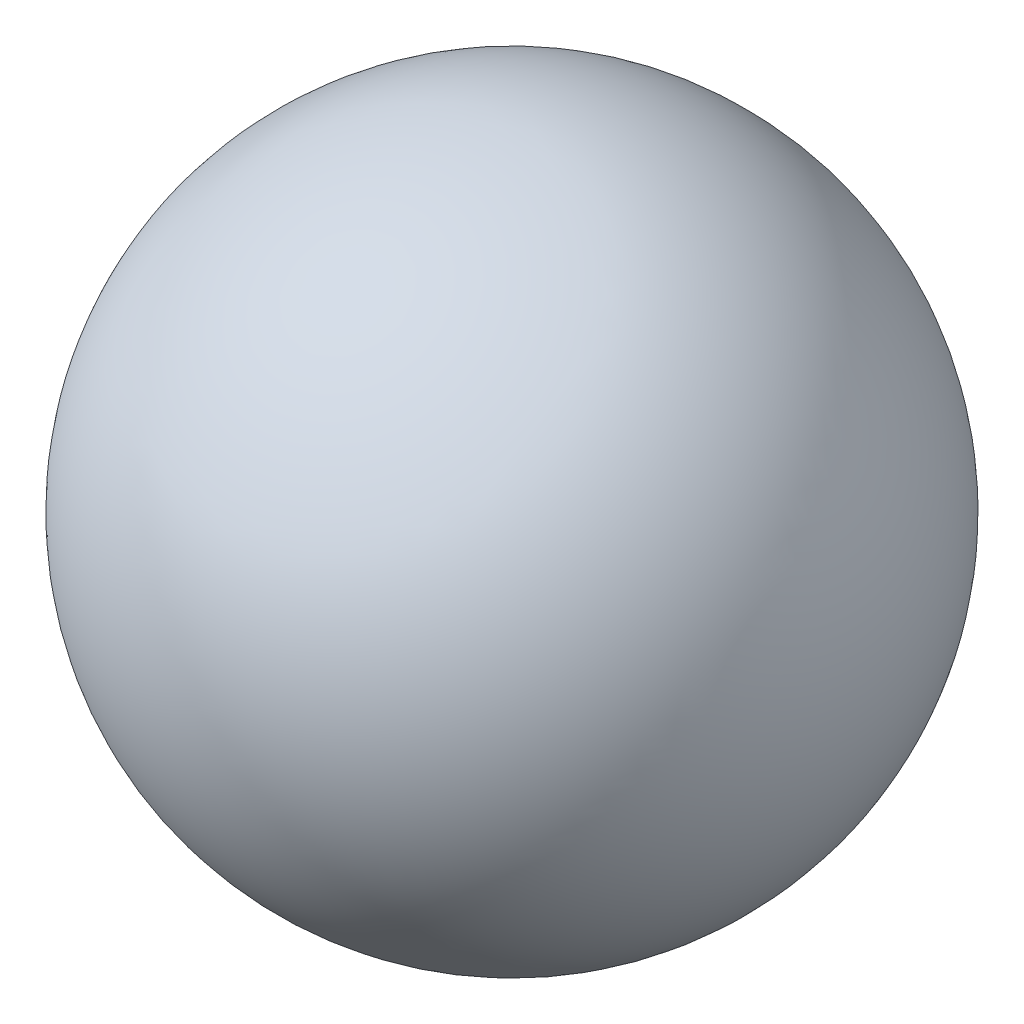
ISO-10303-21;
HEADER;
FILE_DESCRIPTION(('STEP AP214'),'2;1');
FILE_NAME('part.step','',(''),(''),'','','');
FILE_SCHEMA(('AUTOMOTIVE_DESIGN { 1 0 10303 214 1 1 1 1 }'));
ENDSEC;
DATA;
#1=APPLICATION_CONTEXT('core data for automotive mechanical design processes');
#2=APPLICATION_PROTOCOL_DEFINITION('international standard','automotive_design',2000,#1);
#3=PRODUCT_CONTEXT('',#1,'mechanical');
#4=PRODUCT('Part','Part','',(#3));
#5=PRODUCT_RELATED_PRODUCT_CATEGORY('part','',(#4));
#6=PRODUCT_DEFINITION_FORMATION('','',#4);
#7=PRODUCT_DEFINITION_CONTEXT('part definition',#1,'design');
#8=PRODUCT_DEFINITION('design','',#6,#7);
#9=PRODUCT_DEFINITION_SHAPE('','',#8);
#10=(LENGTH_UNIT() NAMED_UNIT(*) SI_UNIT(.MILLI.,.METRE.));
#11=(NAMED_UNIT(*) PLANE_ANGLE_UNIT() SI_UNIT($,.RADIAN.));
#12=(NAMED_UNIT(*) SI_UNIT($,.STERADIAN.) SOLID_ANGLE_UNIT());
#13=UNCERTAINTY_MEASURE_WITH_UNIT(LENGTH_MEASURE(1.E-05),#10,'distance_accuracy_value','');
#14=(GEOMETRIC_REPRESENTATION_CONTEXT(3) GLOBAL_UNCERTAINTY_ASSIGNED_CONTEXT((#13)) GLOBAL_UNIT_ASSIGNED_CONTEXT((#10,
#11,#12)) REPRESENTATION_CONTEXT('',''));
#15=CARTESIAN_POINT('',(0.,0.,0.));
#16=DIRECTION('',(0.,0.,1.));
#17=DIRECTION('',(1.,0.,0.));
#18=AXIS2_PLACEMENT_3D('',#15,#16,#17);
#19=CARTESIAN_POINT('',(1.5,2.95,0.));
#20=DIRECTION('',(-1.,0.,0.));
#21=DIRECTION('',(0.,-1.,0.));
#22=AXIS2_PLACEMENT_3D('',#19,#20,#21);
#23=SPHERICAL_SURFACE('',#22,0.6);
#24=CARTESIAN_POINT('',(0.9,2.95,0.));
#25=VERTEX_POINT('',#24);
#26=VERTEX_LOOP('',#25);
#27=FACE_BOUND('',#26,.T.);
#28=ADVANCED_FACE('F28',(#27),#23,.T.);
#29=CLOSED_SHELL('',(#28));
#30=MANIFOLD_SOLID_BREP('B2',#29);
#31=ADVANCED_BREP_SHAPE_REPRESENTATION('',(#18,#30),#14);
#32=SHAPE_DEFINITION_REPRESENTATION(#9,#31);
ENDSEC;
END-ISO-10303-21;
